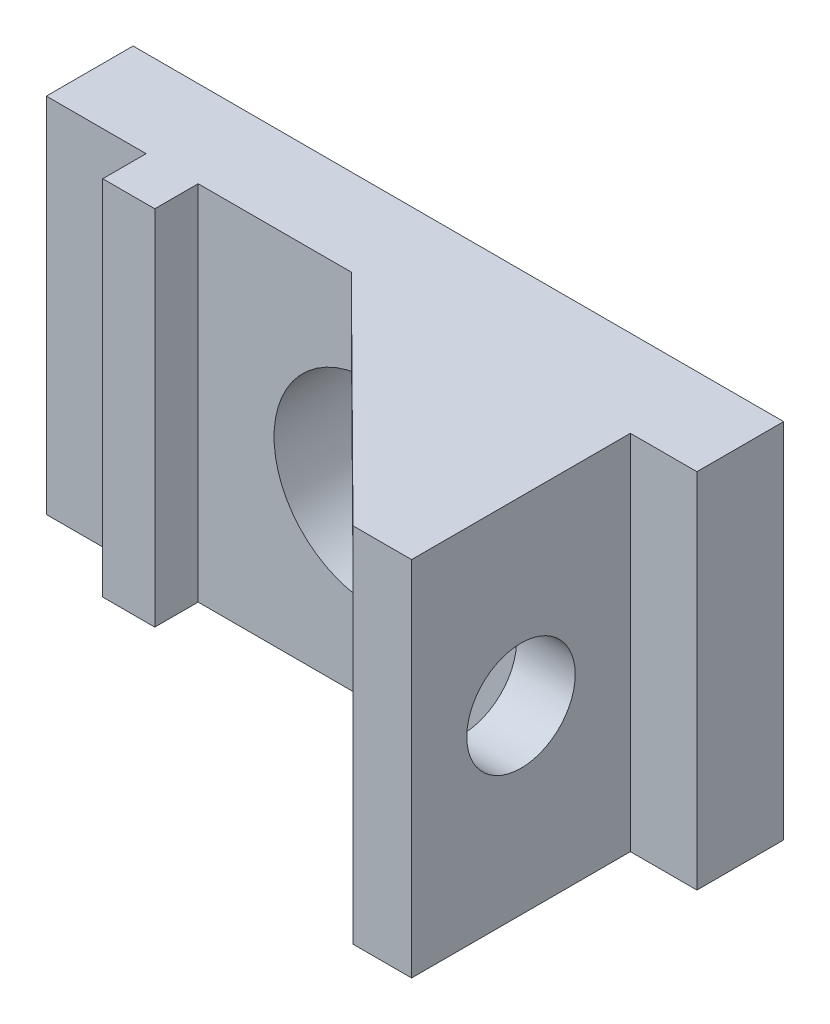
ISO-10303-21;
HEADER;
FILE_DESCRIPTION(('STEP AP214'),'2;1');
FILE_NAME('part.step','',(''),(''),'','','');
FILE_SCHEMA(('AUTOMOTIVE_DESIGN { 1 0 10303 214 1 1 1 1 }'));
ENDSEC;
DATA;
#1=APPLICATION_CONTEXT('core data for automotive mechanical design processes');
#2=APPLICATION_PROTOCOL_DEFINITION('international standard','automotive_design',2000,#1);
#3=PRODUCT_CONTEXT('',#1,'mechanical');
#4=PRODUCT('Part','Part','',(#3));
#5=PRODUCT_RELATED_PRODUCT_CATEGORY('part','',(#4));
#6=PRODUCT_DEFINITION_FORMATION('','',#4);
#7=PRODUCT_DEFINITION_CONTEXT('part definition',#1,'design');
#8=PRODUCT_DEFINITION('design','',#6,#7);
#9=PRODUCT_DEFINITION_SHAPE('','',#8);
#10=(LENGTH_UNIT() NAMED_UNIT(*) SI_UNIT(.MILLI.,.METRE.));
#11=(NAMED_UNIT(*) PLANE_ANGLE_UNIT() SI_UNIT($,.RADIAN.));
#12=(NAMED_UNIT(*) SI_UNIT($,.STERADIAN.) SOLID_ANGLE_UNIT());
#13=UNCERTAINTY_MEASURE_WITH_UNIT(LENGTH_MEASURE(1.E-05),#10,'distance_accuracy_value','');
#14=(GEOMETRIC_REPRESENTATION_CONTEXT(3) GLOBAL_UNCERTAINTY_ASSIGNED_CONTEXT((#13)) GLOBAL_UNIT_ASSIGNED_CONTEXT((#10,
#11,#12)) REPRESENTATION_CONTEXT('',''));
#15=CARTESIAN_POINT('',(0.,0.,0.));
#16=DIRECTION('',(0.,0.,1.));
#17=DIRECTION('',(1.,0.,0.));
#18=AXIS2_PLACEMENT_3D('',#15,#16,#17);
#19=CARTESIAN_POINT('',(121.15851189759,-135.772692902702,70.4495396319373));
#20=DIRECTION('',(-1.,0.,0.));
#21=DIRECTION('',(0.,0.,1.));
#22=AXIS2_PLACEMENT_3D('',#19,#20,#21);
#23=PLANE('',#22);
#24=CARTESIAN_POINT('',(121.15851189759,-41.773464619961,45.2247698159687));
#25=DIRECTION('',(-1.,0.,0.));
#26=DIRECTION('',(0.,0.,1.));
#27=AXIS2_PLACEMENT_3D('',#24,#25,#26);
#28=CIRCLE('',#27,12.5);
#29=CARTESIAN_POINT('',(121.15851189759,-41.773464619961,57.7247698159687));
#30=VERTEX_POINT('',#29);
#31=EDGE_CURVE('E266',#30,#30,#28,.T.);
#32=ORIENTED_EDGE('',*,*,#31,.F.);
#33=EDGE_LOOP('',(#32));
#34=FACE_BOUND('',#33,.T.);
#35=DIRECTION('',(0.,1.,0.));
#36=VECTOR('',#35,1.);
#37=CARTESIAN_POINT('',(121.15851189759,-135.772692902702,70.4495396319373));
#38=LINE('',#37,#36);
#39=CARTESIAN_POINT('',(121.15851189759,-83.546929239922,70.4495396319373));
#40=VERTEX_POINT('',#39);
#41=CARTESIAN_POINT('',(121.15851189759,-10.,70.4495396319373));
#42=VERTEX_POINT('',#41);
#43=EDGE_CURVE('E148',#40,#42,#38,.T.);
#44=ORIENTED_EDGE('',*,*,#43,.T.);
#45=DIRECTION('',(0.,0.,-1.));
#46=VECTOR('',#45,1.);
#47=CARTESIAN_POINT('',(121.15851189759,-10.,20.));
#48=LINE('',#47,#46);
#49=CARTESIAN_POINT('',(121.15851189759,-10.,20.));
#50=VERTEX_POINT('',#49);
#51=EDGE_CURVE('E137',#42,#50,#48,.T.);
#52=ORIENTED_EDGE('',*,*,#51,.T.);
#53=DIRECTION('',(0.,1.,0.));
#54=VECTOR('',#53,1.);
#55=CARTESIAN_POINT('',(121.15851189759,-135.772692902702,20.));
#56=LINE('',#55,#54);
#57=CARTESIAN_POINT('',(121.15851189759,-83.546929239922,20.));
#58=VERTEX_POINT('',#57);
#59=EDGE_CURVE('E146',#58,#50,#56,.T.);
#60=ORIENTED_EDGE('',*,*,#59,.F.);
#61=DIRECTION('',(0.,0.,-1.));
#62=VECTOR('',#61,1.);
#63=CARTESIAN_POINT('',(121.15851189759,-83.546929239922,70.4495396319373));
#64=LINE('',#63,#62);
#65=EDGE_CURVE('E162',#40,#58,#64,.T.);
#66=ORIENTED_EDGE('',*,*,#65,.F.);
#67=EDGE_LOOP('',(#44,#52,#60,#66));
#68=FACE_BOUND('',#67,.T.);
#69=ADVANCED_FACE('F33',(#34,#68),#23,.T.);
#70=CARTESIAN_POINT('',(0.,0.,20.));
#71=DIRECTION('',(0.,0.,1.));
#72=DIRECTION('',(1.,0.,0.));
#73=AXIS2_PLACEMENT_3D('',#70,#71,#72);
#74=PLANE('',#73);
#75=DIRECTION('',(0.,1.,0.));
#76=VECTOR('',#75,1.);
#77=CARTESIAN_POINT('',(134.663116337784,-135.772692902702,20.));
#78=LINE('',#77,#76);
#79=CARTESIAN_POINT('',(134.663116337784,-83.546929239922,20.));
#80=VERTEX_POINT('',#79);
#81=CARTESIAN_POINT('',(134.663116337784,0.,20.));
#82=VERTEX_POINT('',#81);
#83=EDGE_CURVE('E278',#80,#82,#78,.T.);
#84=ORIENTED_EDGE('',*,*,#83,.F.);
#85=DIRECTION('',(1.,0.,0.));
#86=VECTOR('',#85,1.);
#87=CARTESIAN_POINT('',(0.,-83.546929239922,20.));
#88=LINE('',#87,#86);
#89=CARTESIAN_POINT('',(150.,-83.546929239922,20.));
#90=VERTEX_POINT('',#89);
#91=EDGE_CURVE('E175',#80,#90,#88,.T.);
#92=ORIENTED_EDGE('',*,*,#91,.T.);
#93=DIRECTION('',(0.,-1.,0.));
#94=VECTOR('',#93,1.);
#95=CARTESIAN_POINT('',(150.,0.,20.));
#96=LINE('',#95,#94);
#97=CARTESIAN_POINT('',(150.,0.,20.));
#98=VERTEX_POINT('',#97);
#99=EDGE_CURVE('E177',#98,#90,#96,.T.);
#100=ORIENTED_EDGE('',*,*,#99,.F.);
#101=DIRECTION('',(1.,0.,0.));
#102=VECTOR('',#101,1.);
#103=CARTESIAN_POINT('',(0.,0.,20.));
#104=LINE('',#103,#102);
#105=EDGE_CURVE('E56',#82,#98,#104,.T.);
#106=ORIENTED_EDGE('',*,*,#105,.F.);
#107=EDGE_LOOP('',(#84,#92,#100,#106));
#108=FACE_BOUND('',#107,.T.);
#109=ADVANCED_FACE('F292',(#108),#74,.T.);
#110=CARTESIAN_POINT('',(0.,0.,20.));
#111=DIRECTION('',(1.,0.,0.));
#112=DIRECTION('',(0.,0.,-1.));
#113=AXIS2_PLACEMENT_3D('',#110,#111,#112);
#114=PLANE('',#113);
#115=DIRECTION('',(0.,-1.,0.));
#116=VECTOR('',#115,1.);
#117=CARTESIAN_POINT('',(0.,0.,0.));
#118=LINE('',#117,#116);
#119=CARTESIAN_POINT('',(0.,0.,0.));
#120=VERTEX_POINT('',#119);
#121=CARTESIAN_POINT('',(0.,-83.546929239922,0.));
#122=VERTEX_POINT('',#121);
#123=EDGE_CURVE('E211',#120,#122,#118,.T.);
#124=ORIENTED_EDGE('',*,*,#123,.T.);
#125=DIRECTION('',(0.,0.,-1.));
#126=VECTOR('',#125,1.);
#127=CARTESIAN_POINT('',(0.,-83.546929239922,20.));
#128=LINE('',#127,#126);
#129=CARTESIAN_POINT('',(0.,-83.546929239922,20.));
#130=VERTEX_POINT('',#129);
#131=EDGE_CURVE('E11',#130,#122,#128,.T.);
#132=ORIENTED_EDGE('',*,*,#131,.F.);
#133=DIRECTION('',(0.,-1.,0.));
#134=VECTOR('',#133,1.);
#135=CARTESIAN_POINT('',(0.,0.,20.));
#136=LINE('',#135,#134);
#137=CARTESIAN_POINT('',(0.,0.,20.));
#138=VERTEX_POINT('',#137);
#139=EDGE_CURVE('E212',#138,#130,#136,.T.);
#140=ORIENTED_EDGE('',*,*,#139,.F.);
#141=DIRECTION('',(0.,0.,-1.));
#142=VECTOR('',#141,1.);
#143=CARTESIAN_POINT('',(0.,0.,20.));
#144=LINE('',#143,#142);
#145=EDGE_CURVE('E41',#138,#120,#144,.T.);
#146=ORIENTED_EDGE('',*,*,#145,.T.);
#147=EDGE_LOOP('',(#124,#132,#140,#146));
#148=FACE_BOUND('',#147,.T.);
#149=ADVANCED_FACE('F35',(#148),#114,.F.);
#150=CARTESIAN_POINT('',(0.,-83.546929239922,20.));
#151=DIRECTION('',(0.,1.,0.));
#152=DIRECTION('',(0.,0.,1.));
#153=AXIS2_PLACEMENT_3D('',#150,#151,#152);
#154=PLANE('',#153);
#155=DIRECTION('',(1.,0.,0.));
#156=VECTOR('',#155,1.);
#157=CARTESIAN_POINT('',(0.,-83.546929239922,0.));
#158=LINE('',#157,#156);
#159=CARTESIAN_POINT('',(150.,-83.546929239922,0.));
#160=VERTEX_POINT('',#159);
#161=EDGE_CURVE('E227',#122,#160,#158,.T.);
#162=ORIENTED_EDGE('',*,*,#161,.T.);
#163=DIRECTION('',(0.,0.,-1.));
#164=VECTOR('',#163,1.);
#165=CARTESIAN_POINT('',(150.,-83.546929239922,20.));
#166=LINE('',#165,#164);
#167=EDGE_CURVE('E187',#90,#160,#166,.T.);
#168=ORIENTED_EDGE('',*,*,#167,.F.);
#169=ORIENTED_EDGE('',*,*,#91,.F.);
#170=DIRECTION('',(0.,0.,1.));
#171=VECTOR('',#170,1.);
#172=CARTESIAN_POINT('',(134.663116337784,-83.546929239922,20.));
#173=LINE('',#172,#171);
#174=CARTESIAN_POINT('',(134.663116337784,-83.546929239922,70.4495396319373));
#175=VERTEX_POINT('',#174);
#176=EDGE_CURVE('E165',#80,#175,#173,.T.);
#177=ORIENTED_EDGE('',*,*,#176,.T.);
#178=DIRECTION('',(-1.,0.,0.));
#179=VECTOR('',#178,1.);
#180=CARTESIAN_POINT('',(134.663116337784,-83.546929239922,70.4495396319373));
#181=LINE('',#180,#179);
#182=EDGE_CURVE('E276',#175,#40,#181,.T.);
#183=ORIENTED_EDGE('',*,*,#182,.T.);
#184=ORIENTED_EDGE('',*,*,#65,.T.);
#185=CARTESIAN_POINT('',(35.,-83.546929239922,20.));
#186=VERTEX_POINT('',#185);
#187=EDGE_CURVE('E48',#186,#58,#88,.T.);
#188=ORIENTED_EDGE('',*,*,#187,.F.);
#189=DIRECTION('',(0.,0.,-1.));
#190=VECTOR('',#189,1.);
#191=CARTESIAN_POINT('',(35.,-83.546929239922,30.));
#192=LINE('',#191,#190);
#193=CARTESIAN_POINT('',(35.,-83.546929239922,30.));
#194=VERTEX_POINT('',#193);
#195=EDGE_CURVE('E201',#194,#186,#192,.T.);
#196=ORIENTED_EDGE('',*,*,#195,.F.);
#197=DIRECTION('',(1.,0.,0.));
#198=VECTOR('',#197,1.);
#199=CARTESIAN_POINT('',(0.,-83.546929239922,30.));
#200=LINE('',#199,#198);
#201=CARTESIAN_POINT('',(23.,-83.546929239922,30.));
#202=VERTEX_POINT('',#201);
#203=EDGE_CURVE('E199',#202,#194,#200,.T.);
#204=ORIENTED_EDGE('',*,*,#203,.F.);
#205=DIRECTION('',(0.,0.,-1.));
#206=VECTOR('',#205,1.);
#207=CARTESIAN_POINT('',(23.,-83.546929239922,30.));
#208=LINE('',#207,#206);
#209=CARTESIAN_POINT('',(23.,-83.546929239922,20.));
#210=VERTEX_POINT('',#209);
#211=EDGE_CURVE('E203',#202,#210,#208,.T.);
#212=ORIENTED_EDGE('',*,*,#211,.T.);
#213=DIRECTION('',(1.,0.,0.));
#214=VECTOR('',#213,1.);
#215=CARTESIAN_POINT('',(0.,-83.546929239922,20.));
#216=LINE('',#215,#214);
#217=EDGE_CURVE('E215',#130,#210,#216,.T.);
#218=ORIENTED_EDGE('',*,*,#217,.F.);
#219=ORIENTED_EDGE('',*,*,#131,.T.);
#220=EDGE_LOOP('',(#162,#168,#169,#177,#183,#184,#188,#196,#204,#212,#218,#219));
#221=FACE_BOUND('',#220,.T.);
#222=ADVANCED_FACE('F246',(#221),#154,.F.);
#223=CARTESIAN_POINT('',(0.,0.,20.));
#224=DIRECTION('',(0.,1.,0.));
#225=DIRECTION('',(0.,0.,1.));
#226=AXIS2_PLACEMENT_3D('',#223,#224,#225);
#227=PLANE('',#226);
#228=CARTESIAN_POINT('',(35.,0.,20.));
#229=VERTEX_POINT('',#228);
#230=CARTESIAN_POINT('',(70.32093424192,0.,20.));
#231=VERTEX_POINT('',#230);
#232=EDGE_CURVE('E170',#229,#231,#104,.T.);
#233=ORIENTED_EDGE('',*,*,#232,.T.);
#234=DIRECTION('',(0.70981054771433,0.,0.704392636498624));
#235=VECTOR('',#234,1.);
#236=CARTESIAN_POINT('',(121.15851189759,0.,70.4495396319373));
#237=LINE('',#236,#235);
#238=CARTESIAN_POINT('',(121.15851189759,0.,70.4495396319373));
#239=VERTEX_POINT('',#238);
#240=EDGE_CURVE('E149',#231,#239,#237,.T.);
#241=ORIENTED_EDGE('',*,*,#240,.T.);
#242=DIRECTION('',(1.,0.,0.));
#243=VECTOR('',#242,1.);
#244=CARTESIAN_POINT('',(134.663116337784,0.,70.4495396319373));
#245=LINE('',#244,#243);
#246=CARTESIAN_POINT('',(134.663116337784,0.,70.4495396319373));
#247=VERTEX_POINT('',#246);
#248=EDGE_CURVE('E158',#239,#247,#245,.T.);
#249=ORIENTED_EDGE('',*,*,#248,.T.);
#250=DIRECTION('',(0.,0.,-1.));
#251=VECTOR('',#250,1.);
#252=CARTESIAN_POINT('',(134.663116337784,0.,20.));
#253=LINE('',#252,#251);
#254=EDGE_CURVE('E153',#247,#82,#253,.T.);
#255=ORIENTED_EDGE('',*,*,#254,.T.);
#256=ORIENTED_EDGE('',*,*,#105,.T.);
#257=DIRECTION('',(0.,0.,-1.));
#258=VECTOR('',#257,1.);
#259=CARTESIAN_POINT('',(150.,0.,20.));
#260=LINE('',#259,#258);
#261=CARTESIAN_POINT('',(150.,0.,0.));
#262=VERTEX_POINT('',#261);
#263=EDGE_CURVE('E180',#98,#262,#260,.T.);
#264=ORIENTED_EDGE('',*,*,#263,.T.);
#265=DIRECTION('',(1.,0.,0.));
#266=VECTOR('',#265,1.);
#267=CARTESIAN_POINT('',(0.,0.,0.));
#268=LINE('',#267,#266);
#269=EDGE_CURVE('E216',#120,#262,#268,.T.);
#270=ORIENTED_EDGE('',*,*,#269,.F.);
#271=ORIENTED_EDGE('',*,*,#145,.F.);
#272=DIRECTION('',(1.,0.,0.));
#273=VECTOR('',#272,1.);
#274=CARTESIAN_POINT('',(0.,0.,20.));
#275=LINE('',#274,#273);
#276=CARTESIAN_POINT('',(23.,0.,20.));
#277=VERTEX_POINT('',#276);
#278=EDGE_CURVE('E222',#138,#277,#275,.T.);
#279=ORIENTED_EDGE('',*,*,#278,.T.);
#280=DIRECTION('',(0.,0.,-1.));
#281=VECTOR('',#280,1.);
#282=CARTESIAN_POINT('',(23.,0.,30.));
#283=LINE('',#282,#281);
#284=CARTESIAN_POINT('',(23.,0.,30.));
#285=VERTEX_POINT('',#284);
#286=EDGE_CURVE('E206',#285,#277,#283,.T.);
#287=ORIENTED_EDGE('',*,*,#286,.F.);
#288=DIRECTION('',(1.,0.,0.));
#289=VECTOR('',#288,1.);
#290=CARTESIAN_POINT('',(0.,0.,30.));
#291=LINE('',#290,#289);
#292=CARTESIAN_POINT('',(35.,0.,30.));
#293=VERTEX_POINT('',#292);
#294=EDGE_CURVE('E193',#285,#293,#291,.T.);
#295=ORIENTED_EDGE('',*,*,#294,.T.);
#296=DIRECTION('',(0.,0.,-1.));
#297=VECTOR('',#296,1.);
#298=CARTESIAN_POINT('',(35.,0.,30.));
#299=LINE('',#298,#297);
#300=EDGE_CURVE('E208',#293,#229,#299,.T.);
#301=ORIENTED_EDGE('',*,*,#300,.T.);
#302=EDGE_LOOP('',(#233,#241,#249,#255,#256,#264,#270,#271,#279,#287,#295,#301));
#303=FACE_BOUND('',#302,.T.);
#304=ADVANCED_FACE('F239',(#303),#227,.T.);
#305=CARTESIAN_POINT('',(0.,0.,20.));
#306=DIRECTION('',(0.,0.,1.));
#307=DIRECTION('',(1.,0.,0.));
#308=AXIS2_PLACEMENT_3D('',#305,#306,#307);
#309=PLANE('',#308);
#310=ORIENTED_EDGE('',*,*,#139,.T.);
#311=ORIENTED_EDGE('',*,*,#217,.T.);
#312=DIRECTION('',(0.,1.,0.));
#313=VECTOR('',#312,1.);
#314=CARTESIAN_POINT('',(23.,0.,20.));
#315=LINE('',#314,#313);
#316=EDGE_CURVE('E219',#210,#277,#315,.T.);
#317=ORIENTED_EDGE('',*,*,#316,.T.);
#318=ORIENTED_EDGE('',*,*,#278,.F.);
#319=EDGE_LOOP('',(#310,#311,#317,#318));
#320=FACE_BOUND('',#319,.T.);
#321=ADVANCED_FACE('F249',(#320),#309,.T.);
#322=CARTESIAN_POINT('',(0.,0.,0.));
#323=DIRECTION('',(0.,0.,1.));
#324=DIRECTION('',(1.,0.,0.));
#325=AXIS2_PLACEMENT_3D('',#322,#323,#324);
#326=PLANE('',#325);
#327=ORIENTED_EDGE('',*,*,#123,.F.);
#328=ORIENTED_EDGE('',*,*,#269,.T.);
#329=DIRECTION('',(0.,-1.,0.));
#330=VECTOR('',#329,1.);
#331=CARTESIAN_POINT('',(150.,0.,0.));
#332=LINE('',#331,#330);
#333=EDGE_CURVE('E169',#262,#160,#332,.T.);
#334=ORIENTED_EDGE('',*,*,#333,.T.);
#335=ORIENTED_EDGE('',*,*,#161,.F.);
#336=EDGE_LOOP('',(#327,#328,#334,#335));
#337=FACE_BOUND('',#336,.T.);
#338=CARTESIAN_POINT('',(75.,-41.773464619961,0.));
#339=DIRECTION('',(0.,0.,1.));
#340=DIRECTION('',(1.,0.,0.));
#341=AXIS2_PLACEMENT_3D('',#338,#339,#340);
#342=CIRCLE('',#341,22.5);
#343=CARTESIAN_POINT('',(97.5,-41.773464619961,0.));
#344=VERTEX_POINT('',#343);
#345=EDGE_CURVE('E164',#344,#344,#342,.T.);
#346=ORIENTED_EDGE('',*,*,#345,.T.);
#347=EDGE_LOOP('',(#346));
#348=FACE_BOUND('',#347,.T.);
#349=ADVANCED_FACE('F237',(#337,#348),#326,.F.);
#350=CARTESIAN_POINT('',(23.,0.,30.));
#351=DIRECTION('',(-1.,0.,0.));
#352=DIRECTION('',(0.,0.,1.));
#353=AXIS2_PLACEMENT_3D('',#350,#351,#352);
#354=PLANE('',#353);
#355=ORIENTED_EDGE('',*,*,#316,.F.);
#356=ORIENTED_EDGE('',*,*,#211,.F.);
#357=DIRECTION('',(0.,1.,0.));
#358=VECTOR('',#357,1.);
#359=CARTESIAN_POINT('',(23.,0.,30.));
#360=LINE('',#359,#358);
#361=EDGE_CURVE('E196',#202,#285,#360,.T.);
#362=ORIENTED_EDGE('',*,*,#361,.T.);
#363=ORIENTED_EDGE('',*,*,#286,.T.);
#364=EDGE_LOOP('',(#355,#356,#362,#363));
#365=FACE_BOUND('',#364,.T.);
#366=ADVANCED_FACE('F256',(#365),#354,.T.);
#367=CARTESIAN_POINT('',(35.,0.,30.));
#368=DIRECTION('',(1.,0.,0.));
#369=DIRECTION('',(0.,0.,-1.));
#370=AXIS2_PLACEMENT_3D('',#367,#368,#369);
#371=PLANE('',#370);
#372=DIRECTION('',(0.,-1.,0.));
#373=VECTOR('',#372,1.);
#374=CARTESIAN_POINT('',(35.,0.,20.));
#375=LINE('',#374,#373);
#376=EDGE_CURVE('E173',#229,#186,#375,.T.);
#377=ORIENTED_EDGE('',*,*,#376,.F.);
#378=ORIENTED_EDGE('',*,*,#300,.F.);
#379=DIRECTION('',(0.,-1.,0.));
#380=VECTOR('',#379,1.);
#381=CARTESIAN_POINT('',(35.,0.,30.));
#382=LINE('',#381,#380);
#383=EDGE_CURVE('E190',#293,#194,#382,.T.);
#384=ORIENTED_EDGE('',*,*,#383,.T.);
#385=ORIENTED_EDGE('',*,*,#195,.T.);
#386=EDGE_LOOP('',(#377,#378,#384,#385));
#387=FACE_BOUND('',#386,.T.);
#388=ADVANCED_FACE('F259',(#387),#371,.T.);
#389=CARTESIAN_POINT('',(0.,0.,30.));
#390=DIRECTION('',(0.,0.,1.));
#391=DIRECTION('',(1.,0.,0.));
#392=AXIS2_PLACEMENT_3D('',#389,#390,#391);
#393=PLANE('',#392);
#394=ORIENTED_EDGE('',*,*,#383,.F.);
#395=ORIENTED_EDGE('',*,*,#294,.F.);
#396=ORIENTED_EDGE('',*,*,#361,.F.);
#397=ORIENTED_EDGE('',*,*,#203,.T.);
#398=EDGE_LOOP('',(#394,#395,#396,#397));
#399=FACE_BOUND('',#398,.T.);
#400=ADVANCED_FACE('F255',(#399),#393,.T.);
#401=CARTESIAN_POINT('',(75.,-41.773464619961,20.));
#402=DIRECTION('',(0.,0.,-1.));
#403=DIRECTION('',(-1.,0.,0.));
#404=AXIS2_PLACEMENT_3D('',#401,#402,#403);
#405=CYLINDRICAL_SURFACE('',#404,22.5);
#406=CARTESIAN_POINT('',(75.,-41.773464619961,20.));
#407=DIRECTION('',(0.,0.,1.));
#408=DIRECTION('',(1.,0.,0.));
#409=AXIS2_PLACEMENT_3D('',#406,#407,#408);
#410=CIRCLE('',#409,22.5);
#411=CARTESIAN_POINT('',(97.5,-41.773464619961,20.));
#412=VERTEX_POINT('',#411);
#413=EDGE_CURVE('E166',#412,#412,#410,.T.);
#414=ORIENTED_EDGE('',*,*,#413,.T.);
#415=EDGE_LOOP('',(#414));
#416=FACE_BOUND('',#415,.T.);
#417=ORIENTED_EDGE('',*,*,#345,.F.);
#418=EDGE_LOOP('',(#417));
#419=FACE_BOUND('',#418,.T.);
#420=ADVANCED_FACE('F309',(#416,#419),#405,.F.);
#421=CARTESIAN_POINT('',(150.,0.,20.));
#422=DIRECTION('',(1.,0.,0.));
#423=DIRECTION('',(0.,0.,-1.));
#424=AXIS2_PLACEMENT_3D('',#421,#422,#423);
#425=PLANE('',#424);
#426=ORIENTED_EDGE('',*,*,#333,.F.);
#427=ORIENTED_EDGE('',*,*,#263,.F.);
#428=ORIENTED_EDGE('',*,*,#99,.T.);
#429=ORIENTED_EDGE('',*,*,#167,.T.);
#430=EDGE_LOOP('',(#426,#427,#428,#429));
#431=FACE_BOUND('',#430,.T.);
#432=ADVANCED_FACE('F243',(#431),#425,.T.);
#433=DIRECTION('',(0.,1.,0.));
#434=VECTOR('',#433,1.);
#435=CARTESIAN_POINT('',(70.32093424192,-10.,20.));
#436=LINE('',#435,#434);
#437=CARTESIAN_POINT('',(70.32093424192,-10.,20.));
#438=VERTEX_POINT('',#437);
#439=EDGE_CURVE('E261',#438,#231,#436,.T.);
#440=ORIENTED_EDGE('',*,*,#439,.T.);
#441=ORIENTED_EDGE('',*,*,#232,.F.);
#442=ORIENTED_EDGE('',*,*,#376,.T.);
#443=ORIENTED_EDGE('',*,*,#187,.T.);
#444=ORIENTED_EDGE('',*,*,#59,.T.);
#445=DIRECTION('',(-1.,0.,0.));
#446=VECTOR('',#445,1.);
#447=CARTESIAN_POINT('',(70.32093424192,-10.,20.));
#448=LINE('',#447,#446);
#449=EDGE_CURVE('E134',#50,#438,#448,.T.);
#450=ORIENTED_EDGE('',*,*,#449,.T.);
#451=EDGE_LOOP('',(#440,#441,#442,#443,#444,#450));
#452=FACE_BOUND('',#451,.T.);
#453=ORIENTED_EDGE('',*,*,#413,.F.);
#454=EDGE_LOOP('',(#453));
#455=FACE_BOUND('',#454,.T.);
#456=ADVANCED_FACE('F151',(#452,#455),#74,.T.);
#457=CARTESIAN_POINT('',(134.663116337784,-135.772692902702,20.));
#458=DIRECTION('',(1.,0.,0.));
#459=DIRECTION('',(0.,0.,-1.));
#460=AXIS2_PLACEMENT_3D('',#457,#458,#459);
#461=PLANE('',#460);
#462=CARTESIAN_POINT('',(134.663116337784,-41.773464619961,45.2247698159687));
#463=DIRECTION('',(1.,0.,0.));
#464=DIRECTION('',(0.,0.,-1.));
#465=AXIS2_PLACEMENT_3D('',#462,#463,#464);
#466=CIRCLE('',#465,12.5);
#467=CARTESIAN_POINT('',(134.663116337784,-41.773464619961,32.7247698159687));
#468=VERTEX_POINT('',#467);
#469=EDGE_CURVE('E273',#468,#468,#466,.T.);
#470=ORIENTED_EDGE('',*,*,#469,.F.);
#471=EDGE_LOOP('',(#470));
#472=FACE_BOUND('',#471,.T.);
#473=ORIENTED_EDGE('',*,*,#176,.F.);
#474=ORIENTED_EDGE('',*,*,#83,.T.);
#475=ORIENTED_EDGE('',*,*,#254,.F.);
#476=DIRECTION('',(0.,1.,0.));
#477=VECTOR('',#476,1.);
#478=CARTESIAN_POINT('',(134.663116337784,-135.772692902702,70.4495396319373));
#479=LINE('',#478,#477);
#480=EDGE_CURVE('E155',#175,#247,#479,.T.);
#481=ORIENTED_EDGE('',*,*,#480,.F.);
#482=EDGE_LOOP('',(#473,#474,#475,#481));
#483=FACE_BOUND('',#482,.T.);
#484=ADVANCED_FACE('F291',(#472,#483),#461,.T.);
#485=CARTESIAN_POINT('',(134.663116337784,-135.772692902702,70.4495396319373));
#486=DIRECTION('',(0.,0.,1.));
#487=DIRECTION('',(1.,0.,0.));
#488=AXIS2_PLACEMENT_3D('',#485,#486,#487);
#489=PLANE('',#488);
#490=ORIENTED_EDGE('',*,*,#182,.F.);
#491=ORIENTED_EDGE('',*,*,#480,.T.);
#492=ORIENTED_EDGE('',*,*,#248,.F.);
#493=DIRECTION('',(0.,1.,0.));
#494=VECTOR('',#493,1.);
#495=CARTESIAN_POINT('',(121.15851189759,-10.,70.4495396319373));
#496=LINE('',#495,#494);
#497=EDGE_CURVE('E263',#42,#239,#496,.T.);
#498=ORIENTED_EDGE('',*,*,#497,.F.);
#499=ORIENTED_EDGE('',*,*,#43,.F.);
#500=EDGE_LOOP('',(#490,#491,#492,#498,#499));
#501=FACE_BOUND('',#500,.T.);
#502=ADVANCED_FACE('F286',(#501),#489,.T.);
#503=CARTESIAN_POINT('',(150.,-41.773464619961,45.2247698159687));
#504=DIRECTION('',(-1.,0.,0.));
#505=DIRECTION('',(0.,0.,1.));
#506=AXIS2_PLACEMENT_3D('',#503,#504,#505);
#507=CYLINDRICAL_SURFACE('',#506,12.5);
#508=ORIENTED_EDGE('',*,*,#469,.T.);
#509=EDGE_LOOP('',(#508));
#510=FACE_BOUND('',#509,.T.);
#511=ORIENTED_EDGE('',*,*,#31,.T.);
#512=EDGE_LOOP('',(#511));
#513=FACE_BOUND('',#512,.T.);
#514=ADVANCED_FACE('F407',(#510,#513),#507,.F.);
#515=CARTESIAN_POINT('',(121.15851189759,-10.,70.4495396319373));
#516=DIRECTION('',(-0.704392636498624,0.,0.70981054771433));
#517=DIRECTION('',(0.70981054771433,0.,0.704392636498624));
#518=AXIS2_PLACEMENT_3D('',#515,#516,#517);
#519=PLANE('',#518);
#520=ORIENTED_EDGE('',*,*,#240,.F.);
#521=ORIENTED_EDGE('',*,*,#439,.F.);
#522=DIRECTION('',(0.70981054771433,0.,0.704392636498624));
#523=VECTOR('',#522,1.);
#524=CARTESIAN_POINT('',(121.15851189759,-10.,70.4495396319373));
#525=LINE('',#524,#523);
#526=EDGE_CURVE('E139',#438,#42,#525,.T.);
#527=ORIENTED_EDGE('',*,*,#526,.T.);
#528=ORIENTED_EDGE('',*,*,#497,.T.);
#529=EDGE_LOOP('',(#520,#521,#527,#528));
#530=FACE_BOUND('',#529,.T.);
#531=ADVANCED_FACE('F414',(#530),#519,.T.);
#532=CARTESIAN_POINT('',(0.,-10.,0.));
#533=DIRECTION('',(0.,1.,0.));
#534=DIRECTION('',(0.,0.,1.));
#535=AXIS2_PLACEMENT_3D('',#532,#533,#534);
#536=PLANE('',#535);
#537=ORIENTED_EDGE('',*,*,#51,.F.);
#538=ORIENTED_EDGE('',*,*,#526,.F.);
#539=ORIENTED_EDGE('',*,*,#449,.F.);
#540=EDGE_LOOP('',(#537,#538,#539));
#541=FACE_BOUND('',#540,.T.);
#542=ADVANCED_FACE('F136',(#541),#536,.F.);
#543=CLOSED_SHELL('',(#69,#109,#149,#222,#304,#321,#349,#366,#388,#400,#420,#432,#456,#484,#502,
#514,#531,#542));
#544=MANIFOLD_SOLID_BREP('B2',#543);
#545=ADVANCED_BREP_SHAPE_REPRESENTATION('',(#18,#544),#14);
#546=SHAPE_DEFINITION_REPRESENTATION(#9,#545);
ENDSEC;
END-ISO-10303-21;
